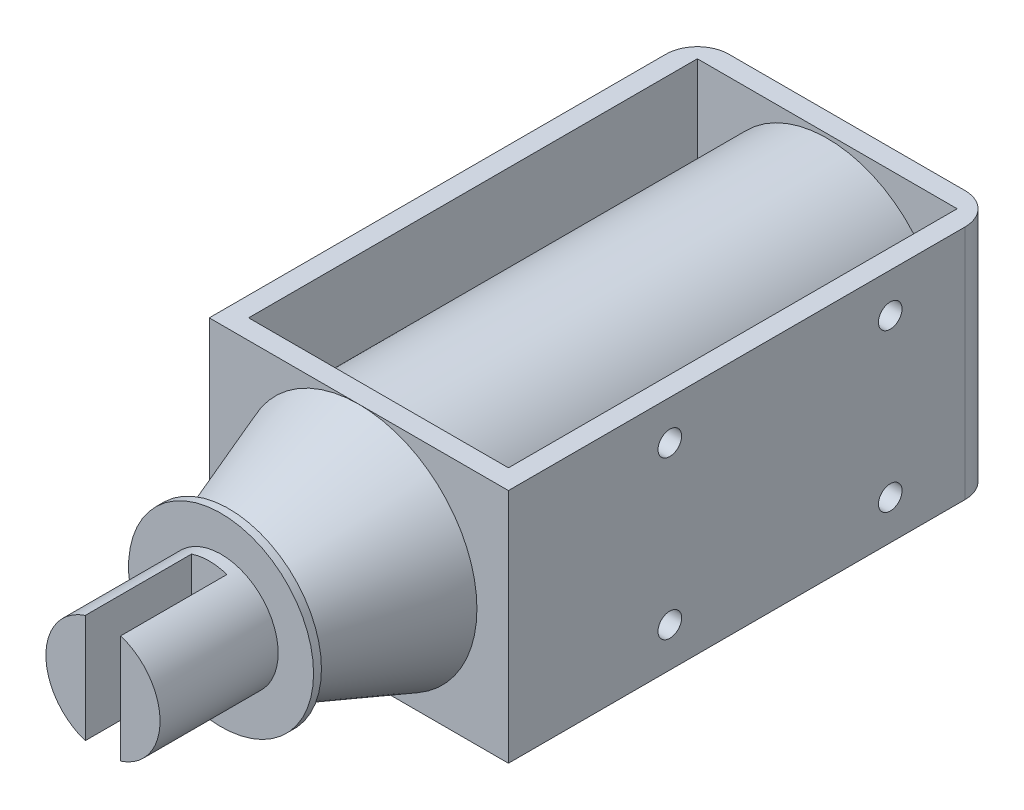
ISO-10303-21;
HEADER;
FILE_DESCRIPTION(('STEP AP214'),'2;1');
FILE_NAME('part.step','',(''),(''),'','','');
FILE_SCHEMA(('AUTOMOTIVE_DESIGN { 1 0 10303 214 1 1 1 1 }'));
ENDSEC;
DATA;
#1=APPLICATION_CONTEXT('core data for automotive mechanical design processes');
#2=APPLICATION_PROTOCOL_DEFINITION('international standard','automotive_design',2000,#1);
#3=PRODUCT_CONTEXT('',#1,'mechanical');
#4=PRODUCT('Part','Part','',(#3));
#5=PRODUCT_RELATED_PRODUCT_CATEGORY('part','',(#4));
#6=PRODUCT_DEFINITION_FORMATION('','',#4);
#7=PRODUCT_DEFINITION_CONTEXT('part definition',#1,'design');
#8=PRODUCT_DEFINITION('design','',#6,#7);
#9=PRODUCT_DEFINITION_SHAPE('','',#8);
#10=(LENGTH_UNIT() NAMED_UNIT(*) SI_UNIT(.MILLI.,.METRE.));
#11=(NAMED_UNIT(*) PLANE_ANGLE_UNIT() SI_UNIT($,.RADIAN.));
#12=(NAMED_UNIT(*) SI_UNIT($,.STERADIAN.) SOLID_ANGLE_UNIT());
#13=UNCERTAINTY_MEASURE_WITH_UNIT(LENGTH_MEASURE(1.E-05),#10,'distance_accuracy_value','');
#14=(GEOMETRIC_REPRESENTATION_CONTEXT(3) GLOBAL_UNCERTAINTY_ASSIGNED_CONTEXT((#13)) GLOBAL_UNIT_ASSIGNED_CONTEXT((#10,
#11,#12)) REPRESENTATION_CONTEXT('',''));
#15=CARTESIAN_POINT('',(0.,0.,0.));
#16=DIRECTION('',(0.,0.,1.));
#17=DIRECTION('',(1.,0.,0.));
#18=AXIS2_PLACEMENT_3D('',#15,#16,#17);
#19=CARTESIAN_POINT('',(-19.,30.,31.));
#20=DIRECTION('',(0.,0.,-1.));
#21=DIRECTION('',(-1.,0.,0.));
#22=AXIS2_PLACEMENT_3D('',#19,#20,#21);
#23=PLANE('',#22);
#24=CARTESIAN_POINT('',(0.,15.,31.));
#25=DIRECTION('',(0.,0.,1.));
#26=DIRECTION('',(1.,0.,0.));
#27=AXIS2_PLACEMENT_3D('',#24,#25,#26);
#28=CIRCLE('',#27,15.);
#29=CARTESIAN_POINT('',(0.,0.,31.));
#30=VERTEX_POINT('',#29);
#31=CARTESIAN_POINT('',(0.,30.,31.));
#32=VERTEX_POINT('',#31);
#33=EDGE_CURVE('E212',#30,#32,#28,.T.);
#34=ORIENTED_EDGE('',*,*,#33,.F.);
#35=DIRECTION('',(1.,0.,0.));
#36=VECTOR('',#35,1.);
#37=CARTESIAN_POINT('',(-19.,0.,31.));
#38=LINE('',#37,#36);
#39=CARTESIAN_POINT('',(19.,0.,31.));
#40=VERTEX_POINT('',#39);
#41=EDGE_CURVE('E199',#30,#40,#38,.T.);
#42=ORIENTED_EDGE('',*,*,#41,.T.);
#43=DIRECTION('',(0.,-1.,0.));
#44=VECTOR('',#43,1.);
#45=CARTESIAN_POINT('',(19.,30.,31.));
#46=LINE('',#45,#44);
#47=CARTESIAN_POINT('',(19.,30.,31.));
#48=VERTEX_POINT('',#47);
#49=EDGE_CURVE('E431',#48,#40,#46,.T.);
#50=ORIENTED_EDGE('',*,*,#49,.F.);
#51=DIRECTION('',(1.,0.,0.));
#52=VECTOR('',#51,1.);
#53=CARTESIAN_POINT('',(-19.,30.,31.));
#54=LINE('',#53,#52);
#55=EDGE_CURVE('E213',#32,#48,#54,.T.);
#56=ORIENTED_EDGE('',*,*,#55,.F.);
#57=EDGE_LOOP('',(#34,#42,#50,#56));
#58=FACE_BOUND('',#57,.T.);
#59=ADVANCED_FACE('F45',(#58),#23,.F.);
#60=CARTESIAN_POINT('',(0.,15.,-31.5));
#61=DIRECTION('',(0.,0.,-1.));
#62=DIRECTION('',(-1.,0.,0.));
#63=AXIS2_PLACEMENT_3D('',#60,#61,#62);
#64=PLANE('',#63);
#65=DIRECTION('',(0.866025403784439,0.5,0.));
#66=VECTOR('',#65,1.);
#67=CARTESIAN_POINT('',(-3.68060796608387,17.125,-31.5));
#68=LINE('',#67,#66);
#69=CARTESIAN_POINT('',(-3.68060796608387,17.125,-31.5));
#70=VERTEX_POINT('',#69);
#71=CARTESIAN_POINT('',(0.,19.25,-31.5));
#72=VERTEX_POINT('',#71);
#73=EDGE_CURVE('E259',#70,#72,#68,.T.);
#74=ORIENTED_EDGE('',*,*,#73,.F.);
#75=CARTESIAN_POINT('',(0.,15.,-31.5));
#76=DIRECTION('',(0.,0.,-1.));
#77=DIRECTION('',(-1.,0.,0.));
#78=AXIS2_PLACEMENT_3D('',#75,#76,#77);
#79=CIRCLE('',#78,4.25);
#80=EDGE_CURVE('E337',#70,#72,#79,.T.);
#81=ORIENTED_EDGE('',*,*,#80,.T.);
#82=EDGE_LOOP('',(#74,#81));
#83=FACE_BOUND('',#82,.T.);
#84=ADVANCED_FACE('F554',(#83),#64,.T.);
#85=DIRECTION('',(0.,1.,0.));
#86=VECTOR('',#85,1.);
#87=CARTESIAN_POINT('',(-3.68060796608387,12.875,-31.5));
#88=LINE('',#87,#86);
#89=CARTESIAN_POINT('',(-3.68060796608386,12.875,-31.5));
#90=VERTEX_POINT('',#89);
#91=EDGE_CURVE('E275',#90,#70,#88,.T.);
#92=ORIENTED_EDGE('',*,*,#91,.F.);
#93=EDGE_CURVE('E336',#90,#70,#79,.T.);
#94=ORIENTED_EDGE('',*,*,#93,.T.);
#95=EDGE_LOOP('',(#92,#94));
#96=FACE_BOUND('',#95,.T.);
#97=ADVANCED_FACE('F558',(#96),#64,.T.);
#98=DIRECTION('',(-0.866025403784439,0.5,0.));
#99=VECTOR('',#98,1.);
#100=CARTESIAN_POINT('',(0.,10.75,-31.5));
#101=LINE('',#100,#99);
#102=CARTESIAN_POINT('',(0.,10.75,-31.5));
#103=VERTEX_POINT('',#102);
#104=EDGE_CURVE('E306',#103,#90,#101,.T.);
#105=ORIENTED_EDGE('',*,*,#104,.F.);
#106=EDGE_CURVE('E512',#103,#90,#79,.T.);
#107=ORIENTED_EDGE('',*,*,#106,.T.);
#108=EDGE_LOOP('',(#105,#107));
#109=FACE_BOUND('',#108,.T.);
#110=ADVANCED_FACE('F705',(#109),#64,.T.);
#111=DIRECTION('',(-0.866025403784439,-0.5,0.));
#112=VECTOR('',#111,1.);
#113=CARTESIAN_POINT('',(3.68060796608387,12.875,-31.5));
#114=LINE('',#113,#112);
#115=CARTESIAN_POINT('',(3.68060796608387,12.875,-31.5));
#116=VERTEX_POINT('',#115);
#117=EDGE_CURVE('E302',#116,#103,#114,.T.);
#118=ORIENTED_EDGE('',*,*,#117,.F.);
#119=EDGE_CURVE('E515',#116,#103,#79,.T.);
#120=ORIENTED_EDGE('',*,*,#119,.T.);
#121=EDGE_LOOP('',(#118,#120));
#122=FACE_BOUND('',#121,.T.);
#123=ADVANCED_FACE('F707',(#122),#64,.T.);
#124=DIRECTION('',(0.,-1.,0.));
#125=VECTOR('',#124,1.);
#126=CARTESIAN_POINT('',(3.68060796608387,17.125,-31.5));
#127=LINE('',#126,#125);
#128=CARTESIAN_POINT('',(3.68060796608387,17.125,-31.5));
#129=VERTEX_POINT('',#128);
#130=EDGE_CURVE('E298',#129,#116,#127,.T.);
#131=ORIENTED_EDGE('',*,*,#130,.F.);
#132=EDGE_CURVE('E518',#129,#116,#79,.T.);
#133=ORIENTED_EDGE('',*,*,#132,.T.);
#134=EDGE_LOOP('',(#131,#133));
#135=FACE_BOUND('',#134,.T.);
#136=ADVANCED_FACE('F612',(#135),#64,.T.);
#137=CARTESIAN_POINT('',(19.,30.,31.));
#138=DIRECTION('',(-1.,0.,0.));
#139=DIRECTION('',(0.,0.,1.));
#140=AXIS2_PLACEMENT_3D('',#137,#138,#139);
#141=PLANE('',#140);
#142=CARTESIAN_POINT('',(19.,5.,-17.5));
#143=DIRECTION('',(1.,0.,0.));
#144=DIRECTION('',(0.,0.,-1.));
#145=AXIS2_PLACEMENT_3D('',#142,#143,#144);
#146=CIRCLE('',#145,1.5);
#147=CARTESIAN_POINT('',(19.,5.,-19.));
#148=VERTEX_POINT('',#147);
#149=EDGE_CURVE('E351',#148,#148,#146,.T.);
#150=ORIENTED_EDGE('',*,*,#149,.F.);
#151=EDGE_LOOP('',(#150));
#152=FACE_BOUND('',#151,.T.);
#153=CARTESIAN_POINT('',(19.,25.,10.5));
#154=DIRECTION('',(1.,0.,0.));
#155=DIRECTION('',(0.,0.,-1.));
#156=AXIS2_PLACEMENT_3D('',#153,#154,#155);
#157=CIRCLE('',#156,1.5);
#158=CARTESIAN_POINT('',(19.,25.,8.99999999999999));
#159=VERTEX_POINT('',#158);
#160=EDGE_CURVE('E350',#159,#159,#157,.T.);
#161=ORIENTED_EDGE('',*,*,#160,.F.);
#162=EDGE_LOOP('',(#161));
#163=FACE_BOUND('',#162,.T.);
#164=CARTESIAN_POINT('',(19.,5.,10.5));
#165=DIRECTION('',(1.,0.,0.));
#166=DIRECTION('',(0.,0.,-1.));
#167=AXIS2_PLACEMENT_3D('',#164,#165,#166);
#168=CIRCLE('',#167,1.5);
#169=CARTESIAN_POINT('',(19.,5.,8.99999999999999));
#170=VERTEX_POINT('',#169);
#171=EDGE_CURVE('E341',#170,#170,#168,.T.);
#172=ORIENTED_EDGE('',*,*,#171,.F.);
#173=EDGE_LOOP('',(#172));
#174=FACE_BOUND('',#173,.T.);
#175=CARTESIAN_POINT('',(19.,25.,-17.5));
#176=DIRECTION('',(1.,0.,0.));
#177=DIRECTION('',(0.,0.,-1.));
#178=AXIS2_PLACEMENT_3D('',#175,#176,#177);
#179=CIRCLE('',#178,1.5);
#180=CARTESIAN_POINT('',(19.,25.,-19.));
#181=VERTEX_POINT('',#180);
#182=EDGE_CURVE('E360',#181,#181,#179,.T.);
#183=ORIENTED_EDGE('',*,*,#182,.F.);
#184=EDGE_LOOP('',(#183));
#185=FACE_BOUND('',#184,.T.);
#186=DIRECTION('',(0.,0.,-1.));
#187=VECTOR('',#186,1.);
#188=CARTESIAN_POINT('',(19.,0.,31.));
#189=LINE('',#188,#187);
#190=CARTESIAN_POINT('',(19.,0.,-27.));
#191=VERTEX_POINT('',#190);
#192=EDGE_CURVE('E205',#40,#191,#189,.T.);
#193=ORIENTED_EDGE('',*,*,#192,.T.);
#194=DIRECTION('',(0.,-1.,0.));
#195=VECTOR('',#194,1.);
#196=CARTESIAN_POINT('',(19.,30.,-27.));
#197=LINE('',#196,#195);
#198=CARTESIAN_POINT('',(19.,30.,-27.));
#199=VERTEX_POINT('',#198);
#200=EDGE_CURVE('E467',#191,#199,#197,.F.);
#201=ORIENTED_EDGE('',*,*,#200,.T.);
#202=DIRECTION('',(0.,0.,-1.));
#203=VECTOR('',#202,1.);
#204=CARTESIAN_POINT('',(19.,30.,31.));
#205=LINE('',#204,#203);
#206=EDGE_CURVE('E198',#48,#199,#205,.T.);
#207=ORIENTED_EDGE('',*,*,#206,.F.);
#208=ORIENTED_EDGE('',*,*,#49,.T.);
#209=EDGE_LOOP('',(#193,#201,#207,#208));
#210=FACE_BOUND('',#209,.T.);
#211=ADVANCED_FACE('F527',(#152,#163,#174,#185,#210),#141,.F.);
#212=CARTESIAN_POINT('',(-19.,30.,-31.));
#213=DIRECTION('',(0.,0.,1.));
#214=DIRECTION('',(1.,0.,0.));
#215=AXIS2_PLACEMENT_3D('',#212,#213,#214);
#216=PLANE('',#215);
#217=CARTESIAN_POINT('',(0.,15.,-31.));
#218=DIRECTION('',(0.,0.,1.));
#219=DIRECTION('',(1.,0.,0.));
#220=AXIS2_PLACEMENT_3D('',#217,#218,#219);
#221=CIRCLE('',#220,4.25);
#222=CARTESIAN_POINT('',(4.25,15.,-31.));
#223=VERTEX_POINT('',#222);
#224=EDGE_CURVE('E269',#223,#223,#221,.F.);
#225=ORIENTED_EDGE('',*,*,#224,.F.);
#226=EDGE_LOOP('',(#225));
#227=FACE_BOUND('',#226,.T.);
#228=DIRECTION('',(-1.,0.,0.));
#229=VECTOR('',#228,1.);
#230=CARTESIAN_POINT('',(-19.,0.,-31.));
#231=LINE('',#230,#229);
#232=CARTESIAN_POINT('',(15.,0.,-31.));
#233=VERTEX_POINT('',#232);
#234=CARTESIAN_POINT('',(-15.,0.,-31.));
#235=VERTEX_POINT('',#234);
#236=EDGE_CURVE('E434',#233,#235,#231,.T.);
#237=ORIENTED_EDGE('',*,*,#236,.T.);
#238=DIRECTION('',(0.,-1.,0.));
#239=VECTOR('',#238,1.);
#240=CARTESIAN_POINT('',(-15.,30.,-31.));
#241=LINE('',#240,#239);
#242=CARTESIAN_POINT('',(-15.,30.,-31.));
#243=VERTEX_POINT('',#242);
#244=EDGE_CURVE('E458',#235,#243,#241,.F.);
#245=ORIENTED_EDGE('',*,*,#244,.T.);
#246=DIRECTION('',(-1.,0.,0.));
#247=VECTOR('',#246,1.);
#248=CARTESIAN_POINT('',(-19.,30.,-31.));
#249=LINE('',#248,#247);
#250=CARTESIAN_POINT('',(15.,30.,-31.));
#251=VERTEX_POINT('',#250);
#252=EDGE_CURVE('E421',#251,#243,#249,.T.);
#253=ORIENTED_EDGE('',*,*,#252,.F.);
#254=DIRECTION('',(0.,-1.,0.));
#255=VECTOR('',#254,1.);
#256=CARTESIAN_POINT('',(15.,30.,-31.));
#257=LINE('',#256,#255);
#258=EDGE_CURVE('E454',#251,#233,#257,.T.);
#259=ORIENTED_EDGE('',*,*,#258,.T.);
#260=EDGE_LOOP('',(#237,#245,#253,#259));
#261=FACE_BOUND('',#260,.T.);
#262=ADVANCED_FACE('F535',(#227,#261),#216,.F.);
#263=CARTESIAN_POINT('',(-19.,30.,31.));
#264=DIRECTION('',(1.,0.,0.));
#265=DIRECTION('',(0.,0.,-1.));
#266=AXIS2_PLACEMENT_3D('',#263,#264,#265);
#267=PLANE('',#266);
#268=DIRECTION('',(0.,0.,1.));
#269=VECTOR('',#268,1.);
#270=CARTESIAN_POINT('',(-19.,30.,31.));
#271=LINE('',#270,#269);
#272=CARTESIAN_POINT('',(-19.,30.,-27.));
#273=VERTEX_POINT('',#272);
#274=CARTESIAN_POINT('',(-19.,30.,31.));
#275=VERTEX_POINT('',#274);
#276=EDGE_CURVE('E425',#273,#275,#271,.T.);
#277=ORIENTED_EDGE('',*,*,#276,.F.);
#278=DIRECTION('',(0.,-1.,0.));
#279=VECTOR('',#278,1.);
#280=CARTESIAN_POINT('',(-19.,30.,-27.));
#281=LINE('',#280,#279);
#282=CARTESIAN_POINT('',(-19.,0.,-27.));
#283=VERTEX_POINT('',#282);
#284=EDGE_CURVE('E444',#273,#283,#281,.T.);
#285=ORIENTED_EDGE('',*,*,#284,.T.);
#286=DIRECTION('',(0.,0.,1.));
#287=VECTOR('',#286,1.);
#288=CARTESIAN_POINT('',(-19.,0.,31.));
#289=LINE('',#288,#287);
#290=CARTESIAN_POINT('',(-19.,0.,31.));
#291=VERTEX_POINT('',#290);
#292=EDGE_CURVE('E210',#283,#291,#289,.T.);
#293=ORIENTED_EDGE('',*,*,#292,.T.);
#294=DIRECTION('',(0.,-1.,0.));
#295=VECTOR('',#294,1.);
#296=CARTESIAN_POINT('',(-19.,30.,31.));
#297=LINE('',#296,#295);
#298=EDGE_CURVE('E194',#275,#291,#297,.T.);
#299=ORIENTED_EDGE('',*,*,#298,.F.);
#300=EDGE_LOOP('',(#277,#285,#293,#299));
#301=FACE_BOUND('',#300,.T.);
#302=ADVANCED_FACE('F543',(#301),#267,.F.);
#303=EDGE_CURVE('E61',#32,#30,#28,.T.);
#304=ORIENTED_EDGE('',*,*,#303,.F.);
#305=EDGE_CURVE('E428',#275,#32,#54,.T.);
#306=ORIENTED_EDGE('',*,*,#305,.F.);
#307=ORIENTED_EDGE('',*,*,#298,.T.);
#308=EDGE_CURVE('E190',#291,#30,#38,.T.);
#309=ORIENTED_EDGE('',*,*,#308,.T.);
#310=EDGE_LOOP('',(#304,#306,#307,#309));
#311=FACE_BOUND('',#310,.T.);
#312=ADVANCED_FACE('F192',(#311),#23,.F.);
#313=CARTESIAN_POINT('',(0.,30.,0.));
#314=DIRECTION('',(0.,-1.,0.));
#315=DIRECTION('',(0.,0.,-1.));
#316=AXIS2_PLACEMENT_3D('',#313,#314,#315);
#317=PLANE('',#316);
#318=DIRECTION('',(0.,0.,1.));
#319=VECTOR('',#318,1.);
#320=CARTESIAN_POINT('',(-16.5,30.,28.5));
#321=LINE('',#320,#319);
#322=CARTESIAN_POINT('',(-16.5,30.,-28.5));
#323=VERTEX_POINT('',#322);
#324=CARTESIAN_POINT('',(-16.5,30.,28.5));
#325=VERTEX_POINT('',#324);
#326=EDGE_CURVE('E379',#323,#325,#321,.T.);
#327=ORIENTED_EDGE('',*,*,#326,.F.);
#328=DIRECTION('',(-1.,0.,0.));
#329=VECTOR('',#328,1.);
#330=CARTESIAN_POINT('',(-16.5,30.,-28.5));
#331=LINE('',#330,#329);
#332=CARTESIAN_POINT('',(16.5,30.,-28.5));
#333=VERTEX_POINT('',#332);
#334=EDGE_CURVE('E383',#333,#323,#331,.T.);
#335=ORIENTED_EDGE('',*,*,#334,.F.);
#336=DIRECTION('',(0.,0.,-1.));
#337=VECTOR('',#336,1.);
#338=CARTESIAN_POINT('',(16.5,30.,28.5));
#339=LINE('',#338,#337);
#340=CARTESIAN_POINT('',(16.5,30.,28.5));
#341=VERTEX_POINT('',#340);
#342=EDGE_CURVE('E374',#341,#333,#339,.T.);
#343=ORIENTED_EDGE('',*,*,#342,.F.);
#344=DIRECTION('',(1.,0.,0.));
#345=VECTOR('',#344,1.);
#346=CARTESIAN_POINT('',(-16.5,30.,28.5));
#347=LINE('',#346,#345);
#348=EDGE_CURVE('E375',#325,#341,#347,.T.);
#349=ORIENTED_EDGE('',*,*,#348,.F.);
#350=EDGE_LOOP('',(#327,#335,#343,#349));
#351=FACE_BOUND('',#350,.T.);
#352=ORIENTED_EDGE('',*,*,#252,.T.);
#353=CARTESIAN_POINT('',(-15.,30.,-27.));
#354=DIRECTION('',(0.,-1.,0.));
#355=DIRECTION('',(0.,0.,-1.));
#356=AXIS2_PLACEMENT_3D('',#353,#354,#355);
#357=CIRCLE('',#356,4.);
#358=EDGE_CURVE('E464',#243,#273,#357,.F.);
#359=ORIENTED_EDGE('',*,*,#358,.T.);
#360=ORIENTED_EDGE('',*,*,#276,.T.);
#361=ORIENTED_EDGE('',*,*,#305,.T.);
#362=ORIENTED_EDGE('',*,*,#55,.T.);
#363=ORIENTED_EDGE('',*,*,#206,.T.);
#364=CARTESIAN_POINT('',(15.,30.,-27.));
#365=DIRECTION('',(0.,-1.,0.));
#366=DIRECTION('',(0.,0.,-1.));
#367=AXIS2_PLACEMENT_3D('',#364,#365,#366);
#368=CIRCLE('',#367,4.);
#369=EDGE_CURVE('E461',#199,#251,#368,.F.);
#370=ORIENTED_EDGE('',*,*,#369,.T.);
#371=EDGE_LOOP('',(#352,#359,#360,#361,#362,#363,#370));
#372=FACE_BOUND('',#371,.T.);
#373=ADVANCED_FACE('F523',(#351,#372),#317,.F.);
#374=CARTESIAN_POINT('',(0.,0.,0.));
#375=DIRECTION('',(0.,-1.,0.));
#376=DIRECTION('',(0.,0.,-1.));
#377=AXIS2_PLACEMENT_3D('',#374,#375,#376);
#378=PLANE('',#377);
#379=DIRECTION('',(-1.,0.,0.));
#380=VECTOR('',#379,1.);
#381=CARTESIAN_POINT('',(-16.5,0.,-28.5));
#382=LINE('',#381,#380);
#383=CARTESIAN_POINT('',(16.5,0.,-28.5));
#384=VERTEX_POINT('',#383);
#385=CARTESIAN_POINT('',(-16.5,0.,-28.5));
#386=VERTEX_POINT('',#385);
#387=EDGE_CURVE('E378',#384,#386,#382,.T.);
#388=ORIENTED_EDGE('',*,*,#387,.T.);
#389=DIRECTION('',(0.,0.,1.));
#390=VECTOR('',#389,1.);
#391=CARTESIAN_POINT('',(-16.5,0.,28.5));
#392=LINE('',#391,#390);
#393=CARTESIAN_POINT('',(-16.5,0.,28.5));
#394=VERTEX_POINT('',#393);
#395=EDGE_CURVE('E405',#386,#394,#392,.T.);
#396=ORIENTED_EDGE('',*,*,#395,.T.);
#397=DIRECTION('',(1.,0.,0.));
#398=VECTOR('',#397,1.);
#399=CARTESIAN_POINT('',(-16.5,0.,28.5));
#400=LINE('',#399,#398);
#401=CARTESIAN_POINT('',(16.5,0.,28.5));
#402=VERTEX_POINT('',#401);
#403=EDGE_CURVE('E400',#394,#402,#400,.T.);
#404=ORIENTED_EDGE('',*,*,#403,.T.);
#405=DIRECTION('',(0.,0.,-1.));
#406=VECTOR('',#405,1.);
#407=CARTESIAN_POINT('',(16.5,0.,28.5));
#408=LINE('',#407,#406);
#409=EDGE_CURVE('E394',#402,#384,#408,.T.);
#410=ORIENTED_EDGE('',*,*,#409,.T.);
#411=EDGE_LOOP('',(#388,#396,#404,#410));
#412=FACE_BOUND('',#411,.T.);
#413=ORIENTED_EDGE('',*,*,#292,.F.);
#414=CARTESIAN_POINT('',(-15.,0.,-27.));
#415=DIRECTION('',(0.,-1.,0.));
#416=DIRECTION('',(0.,0.,-1.));
#417=AXIS2_PLACEMENT_3D('',#414,#415,#416);
#418=CIRCLE('',#417,4.);
#419=EDGE_CURVE('E451',#283,#235,#418,.T.);
#420=ORIENTED_EDGE('',*,*,#419,.T.);
#421=ORIENTED_EDGE('',*,*,#236,.F.);
#422=CARTESIAN_POINT('',(15.,0.,-27.));
#423=DIRECTION('',(0.,-1.,0.));
#424=DIRECTION('',(0.,0.,-1.));
#425=AXIS2_PLACEMENT_3D('',#422,#423,#424);
#426=CIRCLE('',#425,4.);
#427=EDGE_CURVE('E448',#233,#191,#426,.T.);
#428=ORIENTED_EDGE('',*,*,#427,.T.);
#429=ORIENTED_EDGE('',*,*,#192,.F.);
#430=ORIENTED_EDGE('',*,*,#41,.F.);
#431=ORIENTED_EDGE('',*,*,#308,.F.);
#432=EDGE_LOOP('',(#413,#420,#421,#428,#429,#430,#431));
#433=FACE_BOUND('',#432,.T.);
#434=ADVANCED_FACE('F203',(#412,#433),#378,.T.);
#435=CARTESIAN_POINT('',(-16.5,-65.8634952003005,-28.5));
#436=DIRECTION('',(0.,0.,-1.));
#437=DIRECTION('',(-1.,0.,0.));
#438=AXIS2_PLACEMENT_3D('',#435,#436,#437);
#439=PLANE('',#438);
#440=CARTESIAN_POINT('',(0.,15.,-28.5));
#441=DIRECTION('',(0.,0.,-1.));
#442=DIRECTION('',(-1.,0.,0.));
#443=AXIS2_PLACEMENT_3D('',#440,#441,#442);
#444=CIRCLE('',#443,14.5);
#445=CARTESIAN_POINT('',(-14.5,15.,-28.5));
#446=VERTEX_POINT('',#445);
#447=EDGE_CURVE('E474',#446,#446,#444,.F.);
#448=ORIENTED_EDGE('',*,*,#447,.F.);
#449=EDGE_LOOP('',(#448));
#450=FACE_BOUND('',#449,.T.);
#451=DIRECTION('',(0.,1.,0.));
#452=VECTOR('',#451,1.);
#453=CARTESIAN_POINT('',(16.5,-65.8634952003005,-28.5));
#454=LINE('',#453,#452);
#455=EDGE_CURVE('E398',#384,#333,#454,.T.);
#456=ORIENTED_EDGE('',*,*,#455,.T.);
#457=ORIENTED_EDGE('',*,*,#334,.T.);
#458=DIRECTION('',(0.,1.,0.));
#459=VECTOR('',#458,1.);
#460=CARTESIAN_POINT('',(-16.5,-65.8634952003005,-28.5));
#461=LINE('',#460,#459);
#462=EDGE_CURVE('E393',#386,#323,#461,.T.);
#463=ORIENTED_EDGE('',*,*,#462,.F.);
#464=ORIENTED_EDGE('',*,*,#387,.F.);
#465=EDGE_LOOP('',(#456,#457,#463,#464));
#466=FACE_BOUND('',#465,.T.);
#467=ADVANCED_FACE('F565',(#450,#466),#439,.F.);
#468=CARTESIAN_POINT('',(-16.5,-65.8634952003005,28.5));
#469=DIRECTION('',(-1.,0.,0.));
#470=DIRECTION('',(0.,0.,1.));
#471=AXIS2_PLACEMENT_3D('',#468,#469,#470);
#472=PLANE('',#471);
#473=ORIENTED_EDGE('',*,*,#462,.T.);
#474=ORIENTED_EDGE('',*,*,#326,.T.);
#475=DIRECTION('',(0.,1.,0.));
#476=VECTOR('',#475,1.);
#477=CARTESIAN_POINT('',(-16.5,-65.8634952003005,28.5));
#478=LINE('',#477,#476);
#479=EDGE_CURVE('E404',#394,#325,#478,.T.);
#480=ORIENTED_EDGE('',*,*,#479,.F.);
#481=ORIENTED_EDGE('',*,*,#395,.F.);
#482=EDGE_LOOP('',(#473,#474,#480,#481));
#483=FACE_BOUND('',#482,.T.);
#484=ADVANCED_FACE('F572',(#483),#472,.F.);
#485=CARTESIAN_POINT('',(-16.5,-65.8634952003005,28.5));
#486=DIRECTION('',(0.,0.,1.));
#487=DIRECTION('',(1.,0.,0.));
#488=AXIS2_PLACEMENT_3D('',#485,#486,#487);
#489=PLANE('',#488);
#490=CARTESIAN_POINT('',(0.,15.,28.5));
#491=DIRECTION('',(0.,0.,1.));
#492=DIRECTION('',(1.,0.,0.));
#493=AXIS2_PLACEMENT_3D('',#490,#491,#492);
#494=CIRCLE('',#493,14.5);
#495=CARTESIAN_POINT('',(14.5,15.,28.5));
#496=VERTEX_POINT('',#495);
#497=EDGE_CURVE('E470',#496,#496,#494,.F.);
#498=ORIENTED_EDGE('',*,*,#497,.F.);
#499=EDGE_LOOP('',(#498));
#500=FACE_BOUND('',#499,.T.);
#501=ORIENTED_EDGE('',*,*,#479,.T.);
#502=ORIENTED_EDGE('',*,*,#348,.T.);
#503=DIRECTION('',(0.,1.,0.));
#504=VECTOR('',#503,1.);
#505=CARTESIAN_POINT('',(16.5,-65.8634952003005,28.5));
#506=LINE('',#505,#504);
#507=EDGE_CURVE('E399',#402,#341,#506,.T.);
#508=ORIENTED_EDGE('',*,*,#507,.F.);
#509=ORIENTED_EDGE('',*,*,#403,.F.);
#510=EDGE_LOOP('',(#501,#502,#508,#509));
#511=FACE_BOUND('',#510,.T.);
#512=ADVANCED_FACE('F576',(#500,#511),#489,.F.);
#513=CARTESIAN_POINT('',(16.5,-65.8634952003005,28.5));
#514=DIRECTION('',(1.,0.,0.));
#515=DIRECTION('',(0.,0.,-1.));
#516=AXIS2_PLACEMENT_3D('',#513,#514,#515);
#517=PLANE('',#516);
#518=CARTESIAN_POINT('',(16.5,5.,-17.5));
#519=DIRECTION('',(1.,0.,0.));
#520=DIRECTION('',(0.,0.,-1.));
#521=AXIS2_PLACEMENT_3D('',#518,#519,#520);
#522=CIRCLE('',#521,1.5);
#523=CARTESIAN_POINT('',(16.5,5.,-19.));
#524=VERTEX_POINT('',#523);
#525=EDGE_CURVE('E355',#524,#524,#522,.F.);
#526=ORIENTED_EDGE('',*,*,#525,.F.);
#527=EDGE_LOOP('',(#526));
#528=FACE_BOUND('',#527,.T.);
#529=CARTESIAN_POINT('',(16.5,25.,10.5));
#530=DIRECTION('',(1.,0.,0.));
#531=DIRECTION('',(0.,0.,-1.));
#532=AXIS2_PLACEMENT_3D('',#529,#530,#531);
#533=CIRCLE('',#532,1.5);
#534=CARTESIAN_POINT('',(16.5,25.,8.99999999999999));
#535=VERTEX_POINT('',#534);
#536=EDGE_CURVE('E356',#535,#535,#533,.F.);
#537=ORIENTED_EDGE('',*,*,#536,.F.);
#538=EDGE_LOOP('',(#537));
#539=FACE_BOUND('',#538,.T.);
#540=CARTESIAN_POINT('',(16.5,5.,10.5));
#541=DIRECTION('',(1.,0.,0.));
#542=DIRECTION('',(0.,0.,-1.));
#543=AXIS2_PLACEMENT_3D('',#540,#541,#542);
#544=CIRCLE('',#543,1.5);
#545=CARTESIAN_POINT('',(16.5,5.,8.99999999999999));
#546=VERTEX_POINT('',#545);
#547=EDGE_CURVE('E346',#546,#546,#544,.F.);
#548=ORIENTED_EDGE('',*,*,#547,.F.);
#549=EDGE_LOOP('',(#548));
#550=FACE_BOUND('',#549,.T.);
#551=CARTESIAN_POINT('',(16.5,25.,-17.5));
#552=DIRECTION('',(1.,0.,0.));
#553=DIRECTION('',(0.,0.,-1.));
#554=AXIS2_PLACEMENT_3D('',#551,#552,#553);
#555=CIRCLE('',#554,1.5);
#556=CARTESIAN_POINT('',(16.5,25.,-19.));
#557=VERTEX_POINT('',#556);
#558=EDGE_CURVE('E370',#557,#557,#555,.F.);
#559=ORIENTED_EDGE('',*,*,#558,.F.);
#560=EDGE_LOOP('',(#559));
#561=FACE_BOUND('',#560,.T.);
#562=ORIENTED_EDGE('',*,*,#507,.T.);
#563=ORIENTED_EDGE('',*,*,#342,.T.);
#564=ORIENTED_EDGE('',*,*,#455,.F.);
#565=ORIENTED_EDGE('',*,*,#409,.F.);
#566=EDGE_LOOP('',(#562,#563,#564,#565));
#567=FACE_BOUND('',#566,.T.);
#568=ADVANCED_FACE('F580',(#528,#539,#550,#561,#567),#517,.F.);
#569=CARTESIAN_POINT('',(-15.,30.,-27.));
#570=DIRECTION('',(0.,-1.,0.));
#571=DIRECTION('',(0.,0.,-1.));
#572=AXIS2_PLACEMENT_3D('',#569,#570,#571);
#573=CYLINDRICAL_SURFACE('',#572,4.);
#574=ORIENTED_EDGE('',*,*,#358,.F.);
#575=ORIENTED_EDGE('',*,*,#244,.F.);
#576=ORIENTED_EDGE('',*,*,#419,.F.);
#577=ORIENTED_EDGE('',*,*,#284,.F.);
#578=EDGE_LOOP('',(#574,#575,#576,#577));
#579=FACE_BOUND('',#578,.T.);
#580=ADVANCED_FACE('F539',(#579),#573,.T.);
#581=CARTESIAN_POINT('',(15.,30.,-27.));
#582=DIRECTION('',(0.,-1.,0.));
#583=DIRECTION('',(0.,0.,-1.));
#584=AXIS2_PLACEMENT_3D('',#581,#582,#583);
#585=CYLINDRICAL_SURFACE('',#584,4.);
#586=ORIENTED_EDGE('',*,*,#369,.F.);
#587=ORIENTED_EDGE('',*,*,#200,.F.);
#588=ORIENTED_EDGE('',*,*,#427,.F.);
#589=ORIENTED_EDGE('',*,*,#258,.F.);
#590=EDGE_LOOP('',(#586,#587,#588,#589));
#591=FACE_BOUND('',#590,.T.);
#592=ADVANCED_FACE('F530',(#591),#585,.T.);
#593=CARTESIAN_POINT('',(12.2573593128807,25.,-17.5));
#594=DIRECTION('',(1.,0.,0.));
#595=DIRECTION('',(0.,0.,-1.));
#596=AXIS2_PLACEMENT_3D('',#593,#594,#595);
#597=CYLINDRICAL_SURFACE('',#596,1.5);
#598=ORIENTED_EDGE('',*,*,#558,.T.);
#599=EDGE_LOOP('',(#598));
#600=FACE_BOUND('',#599,.T.);
#601=ORIENTED_EDGE('',*,*,#182,.T.);
#602=EDGE_LOOP('',(#601));
#603=FACE_BOUND('',#602,.T.);
#604=ADVANCED_FACE('F585',(#600,#603),#597,.F.);
#605=CARTESIAN_POINT('',(12.2573593128807,5.,10.5));
#606=DIRECTION('',(1.,0.,0.));
#607=DIRECTION('',(0.,0.,-1.));
#608=AXIS2_PLACEMENT_3D('',#605,#606,#607);
#609=CYLINDRICAL_SURFACE('',#608,1.5);
#610=ORIENTED_EDGE('',*,*,#547,.T.);
#611=EDGE_LOOP('',(#610));
#612=FACE_BOUND('',#611,.T.);
#613=ORIENTED_EDGE('',*,*,#171,.T.);
#614=EDGE_LOOP('',(#613));
#615=FACE_BOUND('',#614,.T.);
#616=ADVANCED_FACE('F588',(#612,#615),#609,.F.);
#617=CARTESIAN_POINT('',(12.2573593128807,25.,10.5));
#618=DIRECTION('',(1.,0.,0.));
#619=DIRECTION('',(0.,0.,-1.));
#620=AXIS2_PLACEMENT_3D('',#617,#618,#619);
#621=CYLINDRICAL_SURFACE('',#620,1.5);
#622=ORIENTED_EDGE('',*,*,#536,.T.);
#623=EDGE_LOOP('',(#622));
#624=FACE_BOUND('',#623,.T.);
#625=ORIENTED_EDGE('',*,*,#160,.T.);
#626=EDGE_LOOP('',(#625));
#627=FACE_BOUND('',#626,.T.);
#628=ADVANCED_FACE('F590',(#624,#627),#621,.F.);
#629=CARTESIAN_POINT('',(12.2573593128807,5.,-17.5));
#630=DIRECTION('',(1.,0.,0.));
#631=DIRECTION('',(0.,0.,-1.));
#632=AXIS2_PLACEMENT_3D('',#629,#630,#631);
#633=CYLINDRICAL_SURFACE('',#632,1.5);
#634=ORIENTED_EDGE('',*,*,#525,.T.);
#635=EDGE_LOOP('',(#634));
#636=FACE_BOUND('',#635,.T.);
#637=ORIENTED_EDGE('',*,*,#149,.T.);
#638=EDGE_LOOP('',(#637));
#639=FACE_BOUND('',#638,.T.);
#640=ADVANCED_FACE('F593',(#636,#639),#633,.F.);
#641=CARTESIAN_POINT('',(0.,15.,69.5121933088198));
#642=DIRECTION('',(0.,0.,-1.));
#643=DIRECTION('',(-1.,0.,0.));
#644=AXIS2_PLACEMENT_3D('',#641,#642,#643);
#645=CYLINDRICAL_SURFACE('',#644,14.5);
#646=ORIENTED_EDGE('',*,*,#447,.T.);
#647=EDGE_LOOP('',(#646));
#648=FACE_BOUND('',#647,.T.);
#649=ORIENTED_EDGE('',*,*,#497,.T.);
#650=EDGE_LOOP('',(#649));
#651=FACE_BOUND('',#650,.T.);
#652=ADVANCED_FACE('F597',(#648,#651),#645,.T.);
#653=CARTESIAN_POINT('',(0.,15.,-31.5));
#654=DIRECTION('',(0.,0.,1.));
#655=DIRECTION('',(1.,0.,0.));
#656=AXIS2_PLACEMENT_3D('',#653,#654,#655);
#657=CYLINDRICAL_SURFACE('',#656,4.25);
#658=ORIENTED_EDGE('',*,*,#80,.F.);
#659=ORIENTED_EDGE('',*,*,#93,.F.);
#660=ORIENTED_EDGE('',*,*,#106,.F.);
#661=ORIENTED_EDGE('',*,*,#119,.F.);
#662=ORIENTED_EDGE('',*,*,#132,.F.);
#663=EDGE_CURVE('E342',#72,#129,#79,.T.);
#664=ORIENTED_EDGE('',*,*,#663,.F.);
#665=EDGE_LOOP('',(#658,#659,#660,#661,#662,#664));
#666=FACE_BOUND('',#665,.T.);
#667=ORIENTED_EDGE('',*,*,#224,.T.);
#668=EDGE_LOOP('',(#667));
#669=FACE_BOUND('',#668,.T.);
#670=ADVANCED_FACE('F604',(#666,#669),#657,.T.);
#671=DIRECTION('',(0.866025403784439,-0.499999999999999,0.));
#672=VECTOR('',#671,1.);
#673=CARTESIAN_POINT('',(0.,19.25,-31.5));
#674=LINE('',#673,#672);
#675=EDGE_CURVE('E294',#72,#129,#674,.T.);
#676=ORIENTED_EDGE('',*,*,#675,.F.);
#677=ORIENTED_EDGE('',*,*,#663,.T.);
#678=EDGE_LOOP('',(#676,#677));
#679=FACE_BOUND('',#678,.T.);
#680=ADVANCED_FACE('F561',(#679),#64,.T.);
#681=CARTESIAN_POINT('',(-3.68060796608387,17.125,-34.));
#682=DIRECTION('',(0.5,-0.866025403784438,0.));
#683=DIRECTION('',(0.866025403784439,0.5,0.));
#684=AXIS2_PLACEMENT_3D('',#681,#682,#683);
#685=PLANE('',#684);
#686=ORIENTED_EDGE('',*,*,#73,.T.);
#687=DIRECTION('',(0.,0.,1.));
#688=VECTOR('',#687,1.);
#689=CARTESIAN_POINT('',(0.,19.25,-34.));
#690=LINE('',#689,#688);
#691=CARTESIAN_POINT('',(0.,19.25,-34.));
#692=VERTEX_POINT('',#691);
#693=EDGE_CURVE('E332',#692,#72,#690,.T.);
#694=ORIENTED_EDGE('',*,*,#693,.F.);
#695=DIRECTION('',(0.866025403784439,0.5,0.));
#696=VECTOR('',#695,1.);
#697=CARTESIAN_POINT('',(-3.68060796608387,17.125,-34.));
#698=LINE('',#697,#696);
#699=CARTESIAN_POINT('',(-3.68060796608387,17.125,-34.));
#700=VERTEX_POINT('',#699);
#701=EDGE_CURVE('E270',#700,#692,#698,.T.);
#702=ORIENTED_EDGE('',*,*,#701,.F.);
#703=DIRECTION('',(0.,0.,1.));
#704=VECTOR('',#703,1.);
#705=CARTESIAN_POINT('',(-3.68060796608387,17.125,-34.));
#706=LINE('',#705,#704);
#707=EDGE_CURVE('E290',#700,#70,#706,.T.);
#708=ORIENTED_EDGE('',*,*,#707,.T.);
#709=EDGE_LOOP('',(#686,#694,#702,#708));
#710=FACE_BOUND('',#709,.T.);
#711=ADVANCED_FACE('F610',(#710),#685,.F.);
#712=CARTESIAN_POINT('',(0.,19.25,-34.));
#713=DIRECTION('',(-0.499999999999999,-0.866025403784439,0.));
#714=DIRECTION('',(0.866025403784439,-0.499999999999999,0.));
#715=AXIS2_PLACEMENT_3D('',#712,#713,#714);
#716=PLANE('',#715);
#717=ORIENTED_EDGE('',*,*,#675,.T.);
#718=DIRECTION('',(0.,0.,1.));
#719=VECTOR('',#718,1.);
#720=CARTESIAN_POINT('',(3.68060796608387,17.125,-34.));
#721=LINE('',#720,#719);
#722=CARTESIAN_POINT('',(3.68060796608387,17.125,-34.));
#723=VERTEX_POINT('',#722);
#724=EDGE_CURVE('E328',#723,#129,#721,.T.);
#725=ORIENTED_EDGE('',*,*,#724,.F.);
#726=DIRECTION('',(0.866025403784439,-0.499999999999999,0.));
#727=VECTOR('',#726,1.);
#728=CARTESIAN_POINT('',(0.,19.25,-34.));
#729=LINE('',#728,#727);
#730=EDGE_CURVE('E274',#692,#723,#729,.T.);
#731=ORIENTED_EDGE('',*,*,#730,.F.);
#732=ORIENTED_EDGE('',*,*,#693,.T.);
#733=EDGE_LOOP('',(#717,#725,#731,#732));
#734=FACE_BOUND('',#733,.T.);
#735=ADVANCED_FACE('F615',(#734),#716,.F.);
#736=CARTESIAN_POINT('',(3.68060796608387,17.125,-34.));
#737=DIRECTION('',(-1.,0.,0.));
#738=DIRECTION('',(0.,0.,1.));
#739=AXIS2_PLACEMENT_3D('',#736,#737,#738);
#740=PLANE('',#739);
#741=ORIENTED_EDGE('',*,*,#130,.T.);
#742=DIRECTION('',(0.,0.,1.));
#743=VECTOR('',#742,1.);
#744=CARTESIAN_POINT('',(3.68060796608387,12.875,-34.));
#745=LINE('',#744,#743);
#746=CARTESIAN_POINT('',(3.68060796608387,12.875,-34.));
#747=VERTEX_POINT('',#746);
#748=EDGE_CURVE('E324',#747,#116,#745,.T.);
#749=ORIENTED_EDGE('',*,*,#748,.F.);
#750=DIRECTION('',(0.,-1.,0.));
#751=VECTOR('',#750,1.);
#752=CARTESIAN_POINT('',(3.68060796608387,17.125,-34.));
#753=LINE('',#752,#751);
#754=EDGE_CURVE('E278',#723,#747,#753,.T.);
#755=ORIENTED_EDGE('',*,*,#754,.F.);
#756=ORIENTED_EDGE('',*,*,#724,.T.);
#757=EDGE_LOOP('',(#741,#749,#755,#756));
#758=FACE_BOUND('',#757,.T.);
#759=ADVANCED_FACE('F619',(#758),#740,.F.);
#760=CARTESIAN_POINT('',(3.68060796608387,12.875,-34.));
#761=DIRECTION('',(-0.5,0.866025403784439,0.));
#762=DIRECTION('',(-0.866025403784439,-0.5,0.));
#763=AXIS2_PLACEMENT_3D('',#760,#761,#762);
#764=PLANE('',#763);
#765=ORIENTED_EDGE('',*,*,#117,.T.);
#766=DIRECTION('',(0.,0.,1.));
#767=VECTOR('',#766,1.);
#768=CARTESIAN_POINT('',(0.,10.75,-34.));
#769=LINE('',#768,#767);
#770=CARTESIAN_POINT('',(0.,10.75,-34.));
#771=VERTEX_POINT('',#770);
#772=EDGE_CURVE('E320',#771,#103,#769,.T.);
#773=ORIENTED_EDGE('',*,*,#772,.F.);
#774=DIRECTION('',(-0.866025403784439,-0.5,0.));
#775=VECTOR('',#774,1.);
#776=CARTESIAN_POINT('',(3.68060796608387,12.875,-34.));
#777=LINE('',#776,#775);
#778=EDGE_CURVE('E281',#747,#771,#777,.T.);
#779=ORIENTED_EDGE('',*,*,#778,.F.);
#780=ORIENTED_EDGE('',*,*,#748,.T.);
#781=EDGE_LOOP('',(#765,#773,#779,#780));
#782=FACE_BOUND('',#781,.T.);
#783=ADVANCED_FACE('F623',(#782),#764,.F.);
#784=CARTESIAN_POINT('',(0.,10.75,-34.));
#785=DIRECTION('',(0.5,0.866025403784439,0.));
#786=DIRECTION('',(-0.866025403784439,0.5,0.));
#787=AXIS2_PLACEMENT_3D('',#784,#785,#786);
#788=PLANE('',#787);
#789=ORIENTED_EDGE('',*,*,#104,.T.);
#790=DIRECTION('',(0.,0.,1.));
#791=VECTOR('',#790,1.);
#792=CARTESIAN_POINT('',(-3.68060796608387,12.875,-34.));
#793=LINE('',#792,#791);
#794=CARTESIAN_POINT('',(-3.68060796608387,12.875,-34.));
#795=VERTEX_POINT('',#794);
#796=EDGE_CURVE('E316',#795,#90,#793,.T.);
#797=ORIENTED_EDGE('',*,*,#796,.F.);
#798=DIRECTION('',(-0.866025403784439,0.5,0.));
#799=VECTOR('',#798,1.);
#800=CARTESIAN_POINT('',(0.,10.75,-34.));
#801=LINE('',#800,#799);
#802=EDGE_CURVE('E284',#771,#795,#801,.T.);
#803=ORIENTED_EDGE('',*,*,#802,.F.);
#804=ORIENTED_EDGE('',*,*,#772,.T.);
#805=EDGE_LOOP('',(#789,#797,#803,#804));
#806=FACE_BOUND('',#805,.T.);
#807=ADVANCED_FACE('F627',(#806),#788,.F.);
#808=CARTESIAN_POINT('',(-3.68060796608387,12.875,-34.));
#809=DIRECTION('',(1.,0.,0.));
#810=DIRECTION('',(0.,0.,-1.));
#811=AXIS2_PLACEMENT_3D('',#808,#809,#810);
#812=PLANE('',#811);
#813=ORIENTED_EDGE('',*,*,#91,.T.);
#814=ORIENTED_EDGE('',*,*,#707,.F.);
#815=DIRECTION('',(0.,1.,0.));
#816=VECTOR('',#815,1.);
#817=CARTESIAN_POINT('',(-3.68060796608387,12.875,-34.));
#818=LINE('',#817,#816);
#819=EDGE_CURVE('E287',#795,#700,#818,.T.);
#820=ORIENTED_EDGE('',*,*,#819,.F.);
#821=ORIENTED_EDGE('',*,*,#796,.T.);
#822=EDGE_LOOP('',(#813,#814,#820,#821));
#823=FACE_BOUND('',#822,.T.);
#824=ADVANCED_FACE('F631',(#823),#812,.F.);
#825=CARTESIAN_POINT('',(0.,0.,-34.));
#826=DIRECTION('',(0.,0.,-1.));
#827=DIRECTION('',(-1.,0.,0.));
#828=AXIS2_PLACEMENT_3D('',#825,#826,#827);
#829=PLANE('',#828);
#830=CARTESIAN_POINT('',(0.,15.,-34.));
#831=DIRECTION('',(0.,0.,-1.));
#832=DIRECTION('',(-1.,0.,0.));
#833=AXIS2_PLACEMENT_3D('',#830,#831,#832);
#834=CIRCLE('',#833,3.6);
#835=CARTESIAN_POINT('',(-3.6,15.,-34.));
#836=VERTEX_POINT('',#835);
#837=EDGE_CURVE('E264',#836,#836,#834,.T.);
#838=ORIENTED_EDGE('',*,*,#837,.F.);
#839=EDGE_LOOP('',(#838));
#840=FACE_BOUND('',#839,.T.);
#841=ORIENTED_EDGE('',*,*,#701,.T.);
#842=ORIENTED_EDGE('',*,*,#730,.T.);
#843=ORIENTED_EDGE('',*,*,#754,.T.);
#844=ORIENTED_EDGE('',*,*,#778,.T.);
#845=ORIENTED_EDGE('',*,*,#802,.T.);
#846=ORIENTED_EDGE('',*,*,#819,.T.);
#847=EDGE_LOOP('',(#841,#842,#843,#844,#845,#846));
#848=FACE_BOUND('',#847,.T.);
#849=ADVANCED_FACE('F635',(#840,#848),#829,.T.);
#850=CARTESIAN_POINT('',(0.,15.,-38.5));
#851=DIRECTION('',(0.,0.,1.));
#852=DIRECTION('',(1.,0.,0.));
#853=AXIS2_PLACEMENT_3D('',#850,#851,#852);
#854=CYLINDRICAL_SURFACE('',#853,3.6);
#855=CARTESIAN_POINT('',(0.,15.,-36.5));
#856=DIRECTION('',(0.,0.,-1.));
#857=DIRECTION('',(-1.,0.,0.));
#858=AXIS2_PLACEMENT_3D('',#855,#856,#857);
#859=CIRCLE('',#858,3.6);
#860=CARTESIAN_POINT('',(-3.6,15.,-36.5));
#861=VERTEX_POINT('',#860);
#862=EDGE_CURVE('E254',#861,#861,#859,.F.);
#863=ORIENTED_EDGE('',*,*,#862,.T.);
#864=EDGE_LOOP('',(#863));
#865=FACE_BOUND('',#864,.T.);
#866=ORIENTED_EDGE('',*,*,#837,.T.);
#867=EDGE_LOOP('',(#866));
#868=FACE_BOUND('',#867,.T.);
#869=ADVANCED_FACE('F639',(#865,#868),#854,.T.);
#870=CARTESIAN_POINT('',(0.,15.,-38.5));
#871=DIRECTION('',(0.,0.,-1.));
#872=DIRECTION('',(-1.,0.,0.));
#873=AXIS2_PLACEMENT_3D('',#870,#871,#872);
#874=PLANE('',#873);
#875=CARTESIAN_POINT('',(0.,15.,-38.5));
#876=DIRECTION('',(0.,0.,-1.));
#877=DIRECTION('',(-1.,0.,0.));
#878=AXIS2_PLACEMENT_3D('',#875,#876,#877);
#879=CIRCLE('',#878,1.6);
#880=CARTESIAN_POINT('',(-1.6,15.,-38.5));
#881=VERTEX_POINT('',#880);
#882=EDGE_CURVE('E268',#881,#881,#879,.T.);
#883=ORIENTED_EDGE('',*,*,#882,.T.);
#884=EDGE_LOOP('',(#883));
#885=FACE_BOUND('',#884,.T.);
#886=ADVANCED_FACE('F643',(#885),#874,.T.);
#887=CARTESIAN_POINT('',(0.,15.,-36.5));
#888=DIRECTION('',(0.,0.,-1.));
#889=DIRECTION('',(-1.,0.,0.));
#890=AXIS2_PLACEMENT_3D('',#887,#888,#889);
#891=DEGENERATE_TOROIDAL_SURFACE('',#890,1.6,2.,.T.);
#892=ORIENTED_EDGE('',*,*,#862,.F.);
#893=EDGE_LOOP('',(#892));
#894=FACE_BOUND('',#893,.T.);
#895=ORIENTED_EDGE('',*,*,#882,.F.);
#896=EDGE_LOOP('',(#895));
#897=FACE_BOUND('',#896,.T.);
#898=ADVANCED_FACE('F47',(#894,#897),#891,.T.);
#899=CARTESIAN_POINT('',(0.,15.,31.));
#900=DIRECTION('',(0.,0.,-1.));
#901=DIRECTION('',(1.,0.,0.));
#902=AXIS2_PLACEMENT_3D('',#899,#900,#901);
#903=CONICAL_SURFACE('',#902,15.,0.349065850398867);
#904=ORIENTED_EDGE('',*,*,#303,.T.);
#905=ORIENTED_EDGE('',*,*,#33,.T.);
#906=EDGE_LOOP('',(#904,#905));
#907=FACE_BOUND('',#906,.T.);
#908=CARTESIAN_POINT('',(0.,15.,47.5));
#909=DIRECTION('',(0.,0.,1.));
#910=DIRECTION('',(1.,0.,0.));
#911=AXIS2_PLACEMENT_3D('',#908,#909,#910);
#912=CIRCLE('',#911,8.99449113460765);
#913=CARTESIAN_POINT('',(8.99449113460765,15.,47.5));
#914=VERTEX_POINT('',#913);
#915=EDGE_CURVE('E11',#914,#914,#912,.F.);
#916=ORIENTED_EDGE('',*,*,#915,.T.);
#917=EDGE_LOOP('',(#916));
#918=FACE_BOUND('',#917,.T.);
#919=ADVANCED_FACE('F218',(#907,#918),#903,.T.);
#920=CARTESIAN_POINT('',(0.,15.,63.5));
#921=DIRECTION('',(0.,0.,1.));
#922=DIRECTION('',(1.,0.,0.));
#923=AXIS2_PLACEMENT_3D('',#920,#921,#922);
#924=PLANE('',#923);
#925=DIRECTION('',(0.,-1.,0.));
#926=VECTOR('',#925,1.);
#927=CARTESIAN_POINT('',(-2.25,15.,63.5));
#928=LINE('',#927,#926);
#929=CARTESIAN_POINT('',(-2.25,21.8920243760451,63.5));
#930=VERTEX_POINT('',#929);
#931=CARTESIAN_POINT('',(-2.25,8.10797562395489,63.5));
#932=VERTEX_POINT('',#931);
#933=EDGE_CURVE('E253',#930,#932,#928,.T.);
#934=ORIENTED_EDGE('',*,*,#933,.F.);
#935=CARTESIAN_POINT('',(0.,15.,63.5));
#936=DIRECTION('',(0.,0.,1.));
#937=DIRECTION('',(1.,0.,0.));
#938=AXIS2_PLACEMENT_3D('',#935,#936,#937);
#939=CIRCLE('',#938,7.25);
#940=EDGE_CURVE('E248',#930,#932,#939,.T.);
#941=ORIENTED_EDGE('',*,*,#940,.T.);
#942=EDGE_LOOP('',(#934,#941));
#943=FACE_BOUND('',#942,.T.);
#944=ADVANCED_FACE('F507',(#943),#924,.T.);
#945=CARTESIAN_POINT('',(-2.25,7.75,50.));
#946=DIRECTION('',(-1.,0.,0.));
#947=DIRECTION('',(0.,0.,1.));
#948=AXIS2_PLACEMENT_3D('',#945,#946,#947);
#949=PLANE('',#948);
#950=ORIENTED_EDGE('',*,*,#933,.T.);
#951=DIRECTION('',(0.,0.,-1.));
#952=VECTOR('',#951,1.);
#953=CARTESIAN_POINT('',(-2.25,8.10797562395489,63.5));
#954=LINE('',#953,#952);
#955=CARTESIAN_POINT('',(-2.25,8.10797562395489,50.));
#956=VERTEX_POINT('',#955);
#957=EDGE_CURVE('E230',#956,#932,#954,.F.);
#958=ORIENTED_EDGE('',*,*,#957,.F.);
#959=DIRECTION('',(0.,-1.,0.));
#960=VECTOR('',#959,1.);
#961=CARTESIAN_POINT('',(-2.25,7.75,50.));
#962=LINE('',#961,#960);
#963=CARTESIAN_POINT('',(-2.25,21.8920243760451,50.));
#964=VERTEX_POINT('',#963);
#965=EDGE_CURVE('E224',#964,#956,#962,.T.);
#966=ORIENTED_EDGE('',*,*,#965,.F.);
#967=DIRECTION('',(0.,0.,-1.));
#968=VECTOR('',#967,1.);
#969=CARTESIAN_POINT('',(-2.25,21.8920243760451,63.5));
#970=LINE('',#969,#968);
#971=EDGE_CURVE('E69',#930,#964,#970,.T.);
#972=ORIENTED_EDGE('',*,*,#971,.F.);
#973=EDGE_LOOP('',(#950,#958,#966,#972));
#974=FACE_BOUND('',#973,.T.);
#975=ADVANCED_FACE('F504',(#974),#949,.F.);
#976=DIRECTION('',(0.,1.,0.));
#977=VECTOR('',#976,1.);
#978=CARTESIAN_POINT('',(2.25,15.,63.5));
#979=LINE('',#978,#977);
#980=CARTESIAN_POINT('',(2.25,8.10797562395489,63.5));
#981=VERTEX_POINT('',#980);
#982=CARTESIAN_POINT('',(2.25,21.8920243760451,63.5));
#983=VERTEX_POINT('',#982);
#984=EDGE_CURVE('E489',#981,#983,#979,.T.);
#985=ORIENTED_EDGE('',*,*,#984,.F.);
#986=EDGE_CURVE('E244',#981,#983,#939,.T.);
#987=ORIENTED_EDGE('',*,*,#986,.T.);
#988=EDGE_LOOP('',(#985,#987));
#989=FACE_BOUND('',#988,.T.);
#990=ADVANCED_FACE('F664',(#989),#924,.T.);
#991=CARTESIAN_POINT('',(2.25,7.75,50.));
#992=DIRECTION('',(1.,0.,0.));
#993=DIRECTION('',(0.,0.,-1.));
#994=AXIS2_PLACEMENT_3D('',#991,#992,#993);
#995=PLANE('',#994);
#996=ORIENTED_EDGE('',*,*,#984,.T.);
#997=DIRECTION('',(0.,0.,-1.));
#998=VECTOR('',#997,1.);
#999=CARTESIAN_POINT('',(2.25,21.8920243760451,63.5));
#1000=LINE('',#999,#998);
#1001=CARTESIAN_POINT('',(2.25,21.8920243760451,50.));
#1002=VERTEX_POINT('',#1001);
#1003=EDGE_CURVE('E236',#1002,#983,#1000,.F.);
#1004=ORIENTED_EDGE('',*,*,#1003,.F.);
#1005=DIRECTION('',(0.,1.,0.));
#1006=VECTOR('',#1005,1.);
#1007=CARTESIAN_POINT('',(2.25,7.75,50.));
#1008=LINE('',#1007,#1006);
#1009=CARTESIAN_POINT('',(2.25,8.10797562395489,50.));
#1010=VERTEX_POINT('',#1009);
#1011=EDGE_CURVE('E221',#1010,#1002,#1008,.T.);
#1012=ORIENTED_EDGE('',*,*,#1011,.F.);
#1013=DIRECTION('',(0.,0.,-1.));
#1014=VECTOR('',#1013,1.);
#1015=CARTESIAN_POINT('',(2.25,8.10797562395489,63.5));
#1016=LINE('',#1015,#1014);
#1017=EDGE_CURVE('E240',#981,#1010,#1016,.T.);
#1018=ORIENTED_EDGE('',*,*,#1017,.F.);
#1019=EDGE_LOOP('',(#996,#1004,#1012,#1018));
#1020=FACE_BOUND('',#1019,.T.);
#1021=ADVANCED_FACE('F665',(#1020),#995,.F.);
#1022=CARTESIAN_POINT('',(0.,0.,50.));
#1023=DIRECTION('',(0.,0.,-1.));
#1024=DIRECTION('',(-1.,0.,0.));
#1025=AXIS2_PLACEMENT_3D('',#1022,#1023,#1024);
#1026=PLANE('',#1025);
#1027=ORIENTED_EDGE('',*,*,#965,.T.);
#1028=CARTESIAN_POINT('',(0.,15.,50.));
#1029=DIRECTION('',(0.,0.,-1.));
#1030=DIRECTION('',(-1.,0.,0.));
#1031=AXIS2_PLACEMENT_3D('',#1028,#1029,#1030);
#1032=CIRCLE('',#1031,7.25);
#1033=EDGE_CURVE('E491',#1010,#956,#1032,.T.);
#1034=ORIENTED_EDGE('',*,*,#1033,.F.);
#1035=ORIENTED_EDGE('',*,*,#1011,.T.);
#1036=EDGE_CURVE('E54',#964,#1002,#1032,.T.);
#1037=ORIENTED_EDGE('',*,*,#1036,.F.);
#1038=EDGE_LOOP('',(#1027,#1034,#1035,#1037));
#1039=FACE_BOUND('',#1038,.T.);
#1040=ADVANCED_FACE('F502',(#1039),#1026,.F.);
#1041=CARTESIAN_POINT('',(0.,15.,63.5));
#1042=DIRECTION('',(0.,0.,-1.));
#1043=DIRECTION('',(-1.,0.,0.));
#1044=AXIS2_PLACEMENT_3D('',#1041,#1042,#1043);
#1045=CYLINDRICAL_SURFACE('',#1044,7.25);
#1046=ORIENTED_EDGE('',*,*,#1036,.T.);
#1047=ORIENTED_EDGE('',*,*,#1003,.T.);
#1048=ORIENTED_EDGE('',*,*,#986,.F.);
#1049=ORIENTED_EDGE('',*,*,#1017,.T.);
#1050=ORIENTED_EDGE('',*,*,#1033,.T.);
#1051=ORIENTED_EDGE('',*,*,#957,.T.);
#1052=ORIENTED_EDGE('',*,*,#940,.F.);
#1053=ORIENTED_EDGE('',*,*,#971,.T.);
#1054=EDGE_LOOP('',(#1046,#1047,#1048,#1049,#1050,#1051,#1052,#1053));
#1055=FACE_BOUND('',#1054,.T.);
#1056=CARTESIAN_POINT('',(0.,15.,48.5));
#1057=DIRECTION('',(0.,0.,1.));
#1058=DIRECTION('',(1.,0.,0.));
#1059=AXIS2_PLACEMENT_3D('',#1056,#1057,#1058);
#1060=CIRCLE('',#1059,7.25);
#1061=CARTESIAN_POINT('',(7.25,15.,48.5));
#1062=VERTEX_POINT('',#1061);
#1063=EDGE_CURVE('E249',#1062,#1062,#1060,.T.);
#1064=ORIENTED_EDGE('',*,*,#1063,.T.);
#1065=EDGE_LOOP('',(#1064));
#1066=FACE_BOUND('',#1065,.T.);
#1067=ADVANCED_FACE('F497',(#1055,#1066),#1045,.T.);
#1068=CARTESIAN_POINT('',(0.,15.,48.5));
#1069=DIRECTION('',(0.,0.,1.));
#1070=DIRECTION('',(1.,0.,0.));
#1071=AXIS2_PLACEMENT_3D('',#1068,#1069,#1070);
#1072=PLANE('',#1071);
#1073=ORIENTED_EDGE('',*,*,#1063,.F.);
#1074=EDGE_LOOP('',(#1073));
#1075=FACE_BOUND('',#1074,.T.);
#1076=CARTESIAN_POINT('',(0.,15.,48.5));
#1077=DIRECTION('',(0.,0.,1.));
#1078=DIRECTION('',(1.,0.,0.));
#1079=AXIS2_PLACEMENT_3D('',#1076,#1077,#1078);
#1080=CIRCLE('',#1079,11.75);
#1081=CARTESIAN_POINT('',(11.75,15.,48.5));
#1082=VERTEX_POINT('',#1081);
#1083=EDGE_CURVE('E255',#1082,#1082,#1080,.T.);
#1084=ORIENTED_EDGE('',*,*,#1083,.T.);
#1085=EDGE_LOOP('',(#1084));
#1086=FACE_BOUND('',#1085,.T.);
#1087=ADVANCED_FACE('F652',(#1075,#1086),#1072,.T.);
#1088=CARTESIAN_POINT('',(0.,15.,48.5));
#1089=DIRECTION('',(0.,0.,-1.));
#1090=DIRECTION('',(-1.,0.,0.));
#1091=AXIS2_PLACEMENT_3D('',#1088,#1089,#1090);
#1092=CYLINDRICAL_SURFACE('',#1091,11.75);
#1093=ORIENTED_EDGE('',*,*,#1083,.F.);
#1094=EDGE_LOOP('',(#1093));
#1095=FACE_BOUND('',#1094,.T.);
#1096=CARTESIAN_POINT('',(0.,15.,47.5));
#1097=DIRECTION('',(0.,0.,1.));
#1098=DIRECTION('',(1.,0.,0.));
#1099=AXIS2_PLACEMENT_3D('',#1096,#1097,#1098);
#1100=CIRCLE('',#1099,11.75);
#1101=CARTESIAN_POINT('',(11.75,15.,47.5));
#1102=VERTEX_POINT('',#1101);
#1103=EDGE_CURVE('E260',#1102,#1102,#1100,.T.);
#1104=ORIENTED_EDGE('',*,*,#1103,.T.);
#1105=EDGE_LOOP('',(#1104));
#1106=FACE_BOUND('',#1105,.T.);
#1107=ADVANCED_FACE('F648',(#1095,#1106),#1092,.T.);
#1108=CARTESIAN_POINT('',(0.,15.,47.5));
#1109=DIRECTION('',(0.,0.,1.));
#1110=DIRECTION('',(1.,0.,0.));
#1111=AXIS2_PLACEMENT_3D('',#1108,#1109,#1110);
#1112=PLANE('',#1111);
#1113=ORIENTED_EDGE('',*,*,#915,.F.);
#1114=EDGE_LOOP('',(#1113));
#1115=FACE_BOUND('',#1114,.T.);
#1116=ORIENTED_EDGE('',*,*,#1103,.F.);
#1117=EDGE_LOOP('',(#1116));
#1118=FACE_BOUND('',#1117,.T.);
#1119=ADVANCED_FACE('F651',(#1115,#1118),#1112,.F.);
#1120=CLOSED_SHELL('',(#59,#84,#97,#110,#123,#136,#211,#262,#302,#312,#373,#434,#467,#484,#512,
#568,#580,#592,#604,#616,#628,#640,#652,#670,#680,#711,#735,#759,#783,#807,#824,#849,#869,#886,
#898,#919,#944,#975,#990,#1021,#1040,#1067,#1087,#1107,#1119));
#1121=MANIFOLD_SOLID_BREP('B2',#1120);
#1122=ADVANCED_BREP_SHAPE_REPRESENTATION('',(#18,#1121),#14);
#1123=SHAPE_DEFINITION_REPRESENTATION(#9,#1122);
ENDSEC;
END-ISO-10303-21;
